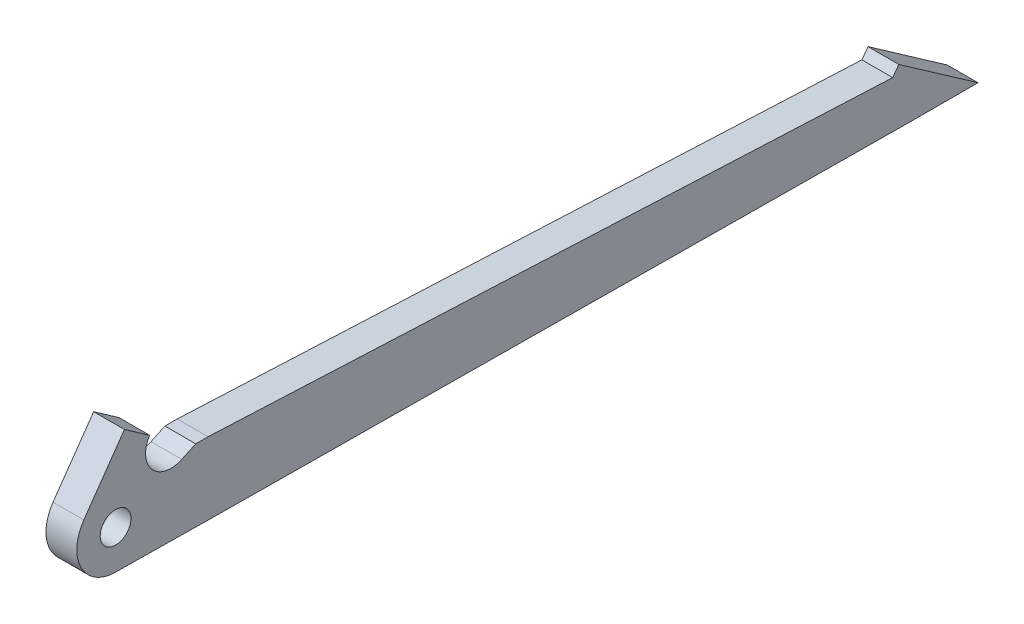
ISO-10303-21;
HEADER;
FILE_DESCRIPTION(('STEP AP214'),'2;1');
FILE_NAME('part.step','',(''),(''),'','','');
FILE_SCHEMA(('AUTOMOTIVE_DESIGN { 1 0 10303 214 1 1 1 1 }'));
ENDSEC;
DATA;
#1=APPLICATION_CONTEXT('core data for automotive mechanical design processes');
#2=APPLICATION_PROTOCOL_DEFINITION('international standard','automotive_design',2000,#1);
#3=PRODUCT_CONTEXT('',#1,'mechanical');
#4=PRODUCT('Part','Part','',(#3));
#5=PRODUCT_RELATED_PRODUCT_CATEGORY('part','',(#4));
#6=PRODUCT_DEFINITION_FORMATION('','',#4);
#7=PRODUCT_DEFINITION_CONTEXT('part definition',#1,'design');
#8=PRODUCT_DEFINITION('design','',#6,#7);
#9=PRODUCT_DEFINITION_SHAPE('','',#8);
#10=(LENGTH_UNIT() NAMED_UNIT(*) SI_UNIT(.MILLI.,.METRE.));
#11=(NAMED_UNIT(*) PLANE_ANGLE_UNIT() SI_UNIT($,.RADIAN.));
#12=(NAMED_UNIT(*) SI_UNIT($,.STERADIAN.) SOLID_ANGLE_UNIT());
#13=UNCERTAINTY_MEASURE_WITH_UNIT(LENGTH_MEASURE(1.E-05),#10,'distance_accuracy_value','');
#14=(GEOMETRIC_REPRESENTATION_CONTEXT(3) GLOBAL_UNCERTAINTY_ASSIGNED_CONTEXT((#13)) GLOBAL_UNIT_ASSIGNED_CONTEXT((#10,
#11,#12)) REPRESENTATION_CONTEXT('',''));
#15=CARTESIAN_POINT('',(0.,0.,0.));
#16=DIRECTION('',(0.,0.,1.));
#17=DIRECTION('',(1.,0.,0.));
#18=AXIS2_PLACEMENT_3D('',#15,#16,#17);
#19=CARTESIAN_POINT('',(4.7625,9.525,-176.47164647412));
#20=DIRECTION('',(1.,0.,0.));
#21=DIRECTION('',(0.,0.,-1.));
#22=AXIS2_PLACEMENT_3D('',#19,#20,#21);
#23=PLANE('',#22);
#24=CARTESIAN_POINT('',(4.7625,9.525,-176.47164647412));
#25=DIRECTION('',(1.,0.,0.));
#26=DIRECTION('',(0.,0.,-1.));
#27=AXIS2_PLACEMENT_3D('',#24,#25,#26);
#28=CIRCLE('',#27,8.00100000000001);
#29=CARTESIAN_POINT('',(4.7625,14.1141850672447,-169.917610967764));
#30=VERTEX_POINT('',#29);
#31=CARTESIAN_POINT('',(4.7625,1.52470715135464,-176.365272906379));
#32=VERTEX_POINT('',#31);
#33=EDGE_CURVE('E200',#30,#32,#28,.T.);
#34=ORIENTED_EDGE('',*,*,#33,.T.);
#35=DIRECTION('',(0.,-0.0132950340883751,-0.999911617128528));
#36=VECTOR('',#35,1.);
#37=CARTESIAN_POINT('',(4.7625,1.27000000001228,-195.521646474134));
#38=LINE('',#37,#36);
#39=CARTESIAN_POINT('',(4.7625,1.27000000001228,-195.521646474134));
#40=VERTEX_POINT('',#39);
#41=EDGE_CURVE('E202',#32,#40,#38,.T.);
#42=ORIENTED_EDGE('',*,*,#41,.T.);
#43=DIRECTION('',(0.,-0.00874942195621806,-0.999961723075155));
#44=VECTOR('',#43,1.);
#45=CARTESIAN_POINT('',(4.7625,1.27000000001228,-195.521646474134));
#46=LINE('',#45,#44);
#47=CARTESIAN_POINT('',(4.7625,1.22755538373154E-11,-340.668536709884));
#48=VERTEX_POINT('',#47);
#49=EDGE_CURVE('E189',#40,#48,#46,.T.);
#50=ORIENTED_EDGE('',*,*,#49,.T.);
#51=DIRECTION('',(0.,0.,-1.));
#52=VECTOR('',#51,1.);
#53=CARTESIAN_POINT('',(4.7625,1.22755538373154E-11,-340.668536709884));
#54=LINE('',#53,#52);
#55=CARTESIAN_POINT('',(4.7625,1.22755538373154E-11,-354.27164647412));
#56=VERTEX_POINT('',#55);
#57=EDGE_CURVE('E140',#48,#56,#54,.T.);
#58=ORIENTED_EDGE('',*,*,#57,.T.);
#59=DIRECTION('',(0.,0.573576436351047,0.819152044288991));
#60=VECTOR('',#59,1.);
#61=CARTESIAN_POINT('',(4.7625,9.52500000002455,-340.668536709884));
#62=LINE('',#61,#60);
#63=CARTESIAN_POINT('',(4.7625,11.4300000000123,-337.947914757058));
#64=VERTEX_POINT('',#63);
#65=EDGE_CURVE('E132',#56,#64,#62,.T.);
#66=ORIENTED_EDGE('',*,*,#65,.T.);
#67=DIRECTION('',(0.,-0.804869964485447,0.593451211363828));
#68=VECTOR('',#67,1.);
#69=CARTESIAN_POINT('',(4.7625,11.4300000000123,-337.947914757058));
#70=LINE('',#69,#68);
#71=CARTESIAN_POINT('',(4.7625,9.70755873555281,-336.677914757058));
#72=VERTEX_POINT('',#71);
#73=EDGE_CURVE('E136',#64,#72,#70,.T.);
#74=ORIENTED_EDGE('',*,*,#73,.T.);
#75=DIRECTION('',(0.,0.0456991439297871,0.998955248369057));
#76=VECTOR('',#75,1.);
#77=CARTESIAN_POINT('',(4.7625,16.1650258056597,-195.52164647412));
#78=LINE('',#77,#76);
#79=CARTESIAN_POINT('',(4.7625,16.1650258056597,-195.52164647412));
#80=VERTEX_POINT('',#79);
#81=EDGE_CURVE('E143',#72,#80,#78,.T.);
#82=ORIENTED_EDGE('',*,*,#81,.T.);
#83=DIRECTION('',(0.,0.,1.));
#84=VECTOR('',#83,1.);
#85=CARTESIAN_POINT('',(4.7625,16.1650258056597,-192.993410989748));
#86=LINE('',#85,#84);
#87=CARTESIAN_POINT('',(4.7625,16.1650258056597,-192.993410989748));
#88=VERTEX_POINT('',#87);
#89=EDGE_CURVE('E204',#80,#88,#86,.T.);
#90=ORIENTED_EDGE('',*,*,#89,.T.);
#91=DIRECTION('',(0.,-0.422618261740697,0.906307787036651));
#92=VECTOR('',#91,1.);
#93=CARTESIAN_POINT('',(4.7625,14.823212824633,-190.115883765906));
#94=LINE('',#93,#92);
#95=CARTESIAN_POINT('',(4.7625,14.823212824633,-190.115883765906));
#96=VERTEX_POINT('',#95);
#97=EDGE_CURVE('E206',#88,#96,#94,.T.);
#98=ORIENTED_EDGE('',*,*,#97,.T.);
#99=CARTESIAN_POINT('',(4.7625,19.5790932010246,-187.898180325126));
#100=DIRECTION('',(-1.,0.,0.));
#101=DIRECTION('',(0.,0.,-1.));
#102=AXIS2_PLACEMENT_3D('',#99,#100,#101);
#103=CIRCLE('',#102,5.24753339253749);
#104=CARTESIAN_POINT('',(4.7625,22.4356903032563,-183.496310301906));
#105=VERTEX_POINT('',#104);
#106=EDGE_CURVE('E208',#96,#105,#103,.T.);
#107=ORIENTED_EDGE('',*,*,#106,.T.);
#108=DIRECTION('',(0.,0.573576436351047,0.819152044288991));
#109=VECTOR('',#108,1.);
#110=CARTESIAN_POINT('',(4.7625,26.0779006740854,-178.294694820671));
#111=LINE('',#110,#109);
#112=CARTESIAN_POINT('',(4.7625,26.0779006740854,-178.294694820671));
#113=VERTEX_POINT('',#112);
#114=EDGE_CURVE('E210',#105,#113,#111,.T.);
#115=ORIENTED_EDGE('',*,*,#114,.T.);
#116=DIRECTION('',(0.,-0.819152044288991,0.573576436351048));
#117=VECTOR('',#116,1.);
#118=CARTESIAN_POINT('',(4.7625,14.1141850672447,-169.917610967764));
#119=LINE('',#118,#117);
#120=EDGE_CURVE('E65',#113,#30,#119,.T.);
#121=ORIENTED_EDGE('',*,*,#120,.T.);
#122=EDGE_LOOP('',(#34,#42,#50,#58,#66,#74,#82,#90,#98,#107,#115,#121));
#123=FACE_BOUND('',#122,.T.);
#124=CARTESIAN_POINT('',(4.7625,9.525,-176.47164647412));
#125=DIRECTION('',(1.,0.,0.));
#126=DIRECTION('',(0.,0.,-1.));
#127=AXIS2_PLACEMENT_3D('',#124,#125,#126);
#128=CIRCLE('',#127,3.17499999999995);
#129=CARTESIAN_POINT('',(4.7625,9.525,-173.296646474121));
#130=VERTEX_POINT('',#129);
#131=EDGE_CURVE('E196',#130,#130,#128,.T.);
#132=ORIENTED_EDGE('',*,*,#131,.F.);
#133=EDGE_LOOP('',(#132));
#134=FACE_BOUND('',#133,.T.);
#135=ADVANCED_FACE('F43',(#123,#134),#23,.T.);
#136=CARTESIAN_POINT('',(4.7625,9.525,-176.47164647412));
#137=DIRECTION('',(-1.,0.,0.));
#138=DIRECTION('',(0.,0.,1.));
#139=AXIS2_PLACEMENT_3D('',#136,#137,#138);
#140=CYLINDRICAL_SURFACE('',#139,8.00100000000001);
#141=DIRECTION('',(-1.,0.,0.));
#142=VECTOR('',#141,1.);
#143=CARTESIAN_POINT('',(4.7625,14.1141850672447,-169.917610967764));
#144=LINE('',#143,#142);
#145=CARTESIAN_POINT('',(-1.5875,14.1141850672447,-169.917610967764));
#146=VERTEX_POINT('',#145);
#147=EDGE_CURVE('E213',#30,#146,#144,.T.);
#148=ORIENTED_EDGE('',*,*,#147,.T.);
#149=CARTESIAN_POINT('',(-1.5875,9.525,-176.47164647412));
#150=DIRECTION('',(1.,0.,0.));
#151=DIRECTION('',(0.,0.,-1.));
#152=AXIS2_PLACEMENT_3D('',#149,#150,#151);
#153=CIRCLE('',#152,8.00100000000001);
#154=CARTESIAN_POINT('',(-1.5875,1.52470715135464,-176.365272906379));
#155=VERTEX_POINT('',#154);
#156=EDGE_CURVE('E171',#146,#155,#153,.T.);
#157=ORIENTED_EDGE('',*,*,#156,.T.);
#158=DIRECTION('',(-1.,0.,0.));
#159=VECTOR('',#158,1.);
#160=CARTESIAN_POINT('',(4.7625,1.52470715135464,-176.365272906379));
#161=LINE('',#160,#159);
#162=EDGE_CURVE('E51',#32,#155,#161,.T.);
#163=ORIENTED_EDGE('',*,*,#162,.F.);
#164=ORIENTED_EDGE('',*,*,#33,.F.);
#165=EDGE_LOOP('',(#148,#157,#163,#164));
#166=FACE_BOUND('',#165,.T.);
#167=ADVANCED_FACE('F45',(#166),#140,.T.);
#168=CARTESIAN_POINT('',(4.7625,1.27000000001228,-195.521646474134));
#169=DIRECTION('',(0.,0.999911617128528,-0.0132950340883751));
#170=DIRECTION('',(0.,0.0132950340883751,0.999911617128529));
#171=AXIS2_PLACEMENT_3D('',#168,#169,#170);
#172=PLANE('',#171);
#173=ORIENTED_EDGE('',*,*,#162,.T.);
#174=DIRECTION('',(0.,-0.0132950340883751,-0.999911617128529));
#175=VECTOR('',#174,1.);
#176=CARTESIAN_POINT('',(-1.5875,1.27000000001228,-195.521646474134));
#177=LINE('',#176,#175);
#178=CARTESIAN_POINT('',(-1.58749999999999,1.27000000001228,-195.521646474134));
#179=VERTEX_POINT('',#178);
#180=EDGE_CURVE('E168',#155,#179,#177,.T.);
#181=ORIENTED_EDGE('',*,*,#180,.T.);
#182=DIRECTION('',(-1.,0.,0.));
#183=VECTOR('',#182,1.);
#184=CARTESIAN_POINT('',(4.7625,1.27000000001228,-195.521646474134));
#185=LINE('',#184,#183);
#186=EDGE_CURVE('E231',#40,#179,#185,.T.);
#187=ORIENTED_EDGE('',*,*,#186,.F.);
#188=ORIENTED_EDGE('',*,*,#41,.F.);
#189=EDGE_LOOP('',(#173,#181,#187,#188));
#190=FACE_BOUND('',#189,.T.);
#191=ADVANCED_FACE('F236',(#190),#172,.F.);
#192=CARTESIAN_POINT('',(4.7625,16.1650258056597,-192.993410989748));
#193=DIRECTION('',(0.,-1.,0.));
#194=DIRECTION('',(0.,0.,-1.));
#195=AXIS2_PLACEMENT_3D('',#192,#193,#194);
#196=PLANE('',#195);
#197=DIRECTION('',(-1.,0.,0.));
#198=VECTOR('',#197,1.);
#199=CARTESIAN_POINT('',(4.7625,16.1650258056597,-195.52164647412));
#200=LINE('',#199,#198);
#201=CARTESIAN_POINT('',(-1.58749999999999,16.1650258056597,-195.52164647412));
#202=VERTEX_POINT('',#201);
#203=EDGE_CURVE('E228',#80,#202,#200,.T.);
#204=ORIENTED_EDGE('',*,*,#203,.T.);
#205=DIRECTION('',(0.,0.,1.));
#206=VECTOR('',#205,1.);
#207=CARTESIAN_POINT('',(-1.5875,16.1650258056597,-192.993410989748));
#208=LINE('',#207,#206);
#209=CARTESIAN_POINT('',(-1.5875,16.1650258056597,-192.993410989748));
#210=VERTEX_POINT('',#209);
#211=EDGE_CURVE('E165',#202,#210,#208,.T.);
#212=ORIENTED_EDGE('',*,*,#211,.T.);
#213=DIRECTION('',(-1.,0.,0.));
#214=VECTOR('',#213,1.);
#215=CARTESIAN_POINT('',(4.7625,16.1650258056597,-192.993410989748));
#216=LINE('',#215,#214);
#217=EDGE_CURVE('E225',#88,#210,#216,.T.);
#218=ORIENTED_EDGE('',*,*,#217,.F.);
#219=ORIENTED_EDGE('',*,*,#89,.F.);
#220=EDGE_LOOP('',(#204,#212,#218,#219));
#221=FACE_BOUND('',#220,.T.);
#222=ADVANCED_FACE('F258',(#221),#196,.F.);
#223=CARTESIAN_POINT('',(4.7625,14.823212824633,-190.115883765906));
#224=DIRECTION('',(0.,-0.906307787036651,-0.422618261740697));
#225=DIRECTION('',(0.,0.422618261740697,-0.906307787036651));
#226=AXIS2_PLACEMENT_3D('',#223,#224,#225);
#227=PLANE('',#226);
#228=ORIENTED_EDGE('',*,*,#217,.T.);
#229=DIRECTION('',(0.,-0.422618261740697,0.906307787036651));
#230=VECTOR('',#229,1.);
#231=CARTESIAN_POINT('',(-1.5875,14.823212824633,-190.115883765906));
#232=LINE('',#231,#230);
#233=CARTESIAN_POINT('',(-1.5875,14.823212824633,-190.115883765906));
#234=VERTEX_POINT('',#233);
#235=EDGE_CURVE('E183',#210,#234,#232,.T.);
#236=ORIENTED_EDGE('',*,*,#235,.T.);
#237=DIRECTION('',(-1.,0.,0.));
#238=VECTOR('',#237,1.);
#239=CARTESIAN_POINT('',(4.7625,14.823212824633,-190.115883765906));
#240=LINE('',#239,#238);
#241=EDGE_CURVE('E222',#96,#234,#240,.T.);
#242=ORIENTED_EDGE('',*,*,#241,.F.);
#243=ORIENTED_EDGE('',*,*,#97,.F.);
#244=EDGE_LOOP('',(#228,#236,#242,#243));
#245=FACE_BOUND('',#244,.T.);
#246=ADVANCED_FACE('F254',(#245),#227,.F.);
#247=CARTESIAN_POINT('',(4.7625,19.5790932010246,-187.898180325126));
#248=DIRECTION('',(-1.,0.,0.));
#249=DIRECTION('',(0.,0.,1.));
#250=AXIS2_PLACEMENT_3D('',#247,#248,#249);
#251=CYLINDRICAL_SURFACE('',#250,5.24753339253749);
#252=ORIENTED_EDGE('',*,*,#241,.T.);
#253=CARTESIAN_POINT('',(-1.5875,19.5790932010246,-187.898180325126));
#254=DIRECTION('',(1.,0.,0.));
#255=DIRECTION('',(0.,0.,-1.));
#256=AXIS2_PLACEMENT_3D('',#253,#254,#255);
#257=CIRCLE('',#256,5.24753339253749);
#258=CARTESIAN_POINT('',(-1.5875,22.4356903032563,-183.496310301906));
#259=VERTEX_POINT('',#258);
#260=EDGE_CURVE('E180',#234,#259,#257,.F.);
#261=ORIENTED_EDGE('',*,*,#260,.T.);
#262=DIRECTION('',(-1.,0.,0.));
#263=VECTOR('',#262,1.);
#264=CARTESIAN_POINT('',(4.7625,22.4356903032563,-183.496310301906));
#265=LINE('',#264,#263);
#266=EDGE_CURVE('E219',#105,#259,#265,.T.);
#267=ORIENTED_EDGE('',*,*,#266,.F.);
#268=ORIENTED_EDGE('',*,*,#106,.F.);
#269=EDGE_LOOP('',(#252,#261,#267,#268));
#270=FACE_BOUND('',#269,.T.);
#271=ADVANCED_FACE('F249',(#270),#251,.F.);
#272=CARTESIAN_POINT('',(4.7625,26.0779006740854,-178.294694820671));
#273=DIRECTION('',(0.,-0.819152044288991,0.573576436351047));
#274=DIRECTION('',(0.,-0.573576436351047,-0.819152044288991));
#275=AXIS2_PLACEMENT_3D('',#272,#273,#274);
#276=PLANE('',#275);
#277=ORIENTED_EDGE('',*,*,#266,.T.);
#278=DIRECTION('',(0.,0.573576436351047,0.819152044288991));
#279=VECTOR('',#278,1.);
#280=CARTESIAN_POINT('',(-1.5875,26.0779006740854,-178.294694820671));
#281=LINE('',#280,#279);
#282=CARTESIAN_POINT('',(-1.5875,26.0779006740854,-178.294694820671));
#283=VERTEX_POINT('',#282);
#284=EDGE_CURVE('E177',#259,#283,#281,.T.);
#285=ORIENTED_EDGE('',*,*,#284,.T.);
#286=DIRECTION('',(-1.,0.,0.));
#287=VECTOR('',#286,1.);
#288=CARTESIAN_POINT('',(4.7625,26.0779006740854,-178.294694820671));
#289=LINE('',#288,#287);
#290=EDGE_CURVE('E216',#113,#283,#289,.T.);
#291=ORIENTED_EDGE('',*,*,#290,.F.);
#292=ORIENTED_EDGE('',*,*,#114,.F.);
#293=EDGE_LOOP('',(#277,#285,#291,#292));
#294=FACE_BOUND('',#293,.T.);
#295=ADVANCED_FACE('F246',(#294),#276,.F.);
#296=CARTESIAN_POINT('',(4.7625,14.1141850672447,-169.917610967764));
#297=DIRECTION('',(0.,-0.573576436351048,-0.81915204428899));
#298=DIRECTION('',(0.,0.819152044288991,-0.573576436351048));
#299=AXIS2_PLACEMENT_3D('',#296,#297,#298);
#300=PLANE('',#299);
#301=ORIENTED_EDGE('',*,*,#290,.T.);
#302=DIRECTION('',(0.,-0.819152044288991,0.573576436351048));
#303=VECTOR('',#302,1.);
#304=CARTESIAN_POINT('',(-1.5875,14.1141850672447,-169.917610967764));
#305=LINE('',#304,#303);
#306=EDGE_CURVE('E174',#283,#146,#305,.T.);
#307=ORIENTED_EDGE('',*,*,#306,.T.);
#308=ORIENTED_EDGE('',*,*,#147,.F.);
#309=ORIENTED_EDGE('',*,*,#120,.F.);
#310=EDGE_LOOP('',(#301,#307,#308,#309));
#311=FACE_BOUND('',#310,.T.);
#312=ADVANCED_FACE('F242',(#311),#300,.F.);
#313=CARTESIAN_POINT('',(4.7625,9.525,-176.47164647412));
#314=DIRECTION('',(-1.,0.,0.));
#315=DIRECTION('',(0.,0.,1.));
#316=AXIS2_PLACEMENT_3D('',#313,#314,#315);
#317=CYLINDRICAL_SURFACE('',#316,3.17499999999995);
#318=CARTESIAN_POINT('',(-1.5875,9.525,-176.47164647412));
#319=DIRECTION('',(1.,0.,0.));
#320=DIRECTION('',(0.,0.,-1.));
#321=AXIS2_PLACEMENT_3D('',#318,#319,#320);
#322=CIRCLE('',#321,3.17499999999995);
#323=CARTESIAN_POINT('',(-1.5875,9.525,-173.296646474121));
#324=VERTEX_POINT('',#323);
#325=EDGE_CURVE('E186',#324,#324,#322,.T.);
#326=CARTESIAN_POINT('',(-1.5875,9.525,-173.296646474121));
#327=CARTESIAN_POINT('',(-1.52135416666667,9.525,-173.296646474121));
#328=CARTESIAN_POINT('',(-1.45520833333333,9.525,-173.296646474121));
#329=CARTESIAN_POINT('',(-1.32291666666667,9.525,-173.296646474121));
#330=CARTESIAN_POINT('',(-1.25677083333333,9.525,-173.296646474121));
#331=CARTESIAN_POINT('',(-1.12447916666667,9.525,-173.296646474121));
#332=CARTESIAN_POINT('',(-1.05833333333333,9.525,-173.296646474121));
#333=CARTESIAN_POINT('',(-0.926041666666667,9.525,-173.296646474121));
#334=CARTESIAN_POINT('',(-0.859895833333334,9.525,-173.296646474121));
#335=CARTESIAN_POINT('',(-0.727604166666667,9.525,-173.296646474121));
#336=CARTESIAN_POINT('',(-0.661458333333334,9.525,-173.296646474121));
#337=CARTESIAN_POINT('',(-0.529166666666667,9.525,-173.296646474121));
#338=CARTESIAN_POINT('',(-0.463020833333333,9.525,-173.296646474121));
#339=CARTESIAN_POINT('',(-0.330729166666666,9.525,-173.296646474121));
#340=CARTESIAN_POINT('',(-0.264583333333333,9.525,-173.296646474121));
#341=CARTESIAN_POINT('',(-0.132291666666667,9.525,-173.296646474121));
#342=CARTESIAN_POINT('',(-0.0661458333333333,9.525,-173.296646474121));
#343=CARTESIAN_POINT('',(0.0661458333333333,9.525,-173.296646474121));
#344=CARTESIAN_POINT('',(0.132291666666667,9.525,-173.296646474121));
#345=CARTESIAN_POINT('',(0.264583333333333,9.525,-173.296646474121));
#346=CARTESIAN_POINT('',(0.330729166666666,9.525,-173.296646474121));
#347=CARTESIAN_POINT('',(0.463020833333333,9.525,-173.296646474121));
#348=CARTESIAN_POINT('',(0.529166666666667,9.525,-173.296646474121));
#349=CARTESIAN_POINT('',(0.661458333333334,9.525,-173.296646474121));
#350=CARTESIAN_POINT('',(0.727604166666667,9.525,-173.296646474121));
#351=CARTESIAN_POINT('',(0.859895833333333,9.525,-173.296646474121));
#352=CARTESIAN_POINT('',(0.926041666666666,9.525,-173.296646474121));
#353=CARTESIAN_POINT('',(1.05833333333333,9.525,-173.296646474121));
#354=CARTESIAN_POINT('',(1.12447916666667,9.525,-173.296646474121));
#355=CARTESIAN_POINT('',(1.25677083333333,9.525,-173.296646474121));
#356=CARTESIAN_POINT('',(1.32291666666667,9.525,-173.296646474121));
#357=CARTESIAN_POINT('',(1.45520833333333,9.525,-173.296646474121));
#358=CARTESIAN_POINT('',(1.52135416666667,9.525,-173.296646474121));
#359=CARTESIAN_POINT('',(1.65364583333333,9.525,-173.296646474121));
#360=CARTESIAN_POINT('',(1.71979166666667,9.525,-173.296646474121));
#361=CARTESIAN_POINT('',(1.85208333333333,9.525,-173.296646474121));
#362=CARTESIAN_POINT('',(1.91822916666667,9.525,-173.296646474121));
#363=CARTESIAN_POINT('',(2.05052083333333,9.525,-173.296646474121));
#364=CARTESIAN_POINT('',(2.11666666666667,9.525,-173.296646474121));
#365=CARTESIAN_POINT('',(2.24895833333333,9.525,-173.296646474121));
#366=CARTESIAN_POINT('',(2.31510416666667,9.525,-173.296646474121));
#367=CARTESIAN_POINT('',(2.44739583333333,9.525,-173.296646474121));
#368=CARTESIAN_POINT('',(2.51354166666667,9.525,-173.296646474121));
#369=CARTESIAN_POINT('',(2.64583333333333,9.525,-173.296646474121));
#370=CARTESIAN_POINT('',(2.71197916666667,9.525,-173.296646474121));
#371=CARTESIAN_POINT('',(2.84427083333333,9.525,-173.296646474121));
#372=CARTESIAN_POINT('',(2.91041666666667,9.525,-173.296646474121));
#373=CARTESIAN_POINT('',(3.04270833333333,9.525,-173.296646474121));
#374=CARTESIAN_POINT('',(3.10885416666667,9.525,-173.296646474121));
#375=CARTESIAN_POINT('',(3.24114583333333,9.525,-173.296646474121));
#376=CARTESIAN_POINT('',(3.30729166666667,9.525,-173.296646474121));
#377=CARTESIAN_POINT('',(3.43958333333333,9.525,-173.296646474121));
#378=CARTESIAN_POINT('',(3.50572916666667,9.525,-173.296646474121));
#379=CARTESIAN_POINT('',(3.63802083333333,9.525,-173.296646474121));
#380=CARTESIAN_POINT('',(3.70416666666667,9.525,-173.296646474121));
#381=CARTESIAN_POINT('',(3.83645833333333,9.525,-173.296646474121));
#382=CARTESIAN_POINT('',(3.90260416666667,9.525,-173.296646474121));
#383=CARTESIAN_POINT('',(4.03489583333333,9.525,-173.296646474121));
#384=CARTESIAN_POINT('',(4.10104166666667,9.525,-173.296646474121));
#385=CARTESIAN_POINT('',(4.23333333333333,9.525,-173.296646474121));
#386=CARTESIAN_POINT('',(4.29947916666667,9.525,-173.296646474121));
#387=CARTESIAN_POINT('',(4.43177083333333,9.525,-173.296646474121));
#388=CARTESIAN_POINT('',(4.49791666666667,9.525,-173.296646474121));
#389=CARTESIAN_POINT('',(4.63020833333333,9.525,-173.296646474121));
#390=CARTESIAN_POINT('',(4.69635416666667,9.525,-173.296646474121));
#391=CARTESIAN_POINT('',(4.7625,9.525,-173.296646474121));
#392=B_SPLINE_CURVE_WITH_KNOTS('',3,(#326,#327,#328,#329,#330,#331,#332,#333,#334,#335,#336,
#337,#338,#339,#340,#341,#342,#343,#344,#345,#346,#347,#348,#349,#350,#351,#352,#353,#354,#355,
#356,#357,#358,#359,#360,#361,#362,#363,#364,#365,#366,#367,#368,#369,#370,#371,#372,#373,#374,
#375,#376,#377,#378,#379,#380,#381,#382,#383,#384,#385,#386,#387,#388,#389,#390,#391),
.UNSPECIFIED.,.F.,.F.,(4,2,2,2,2,2,2,2,2,2,2,2,2,2,2,2,2,2,2,2,2,2,2,2,2,2,2,2,2,2,2,2,4),(0.,
0.1984375,0.396875,0.5953125,0.79375,0.9921875,1.190625,1.3890625,1.5875,1.7859375,1.984375,
2.1828125,2.38125,2.5796875,2.778125,2.9765625,3.175,3.3734375,3.571875,3.7703125,3.96875,
4.1671875,4.365625,4.5640625,4.7625,4.9609375,5.159375,5.3578125,5.55625,5.7546875,5.953125,
6.1515625,6.35),.UNSPECIFIED.);
#393=EDGE_CURVE('BSEAM285',#324,#130,#392,.T.);
#394=ORIENTED_EDGE('',*,*,#325,.F.);
#395=ORIENTED_EDGE('',*,*,#131,.T.);
#396=ORIENTED_EDGE('',*,*,#393,.T.);
#397=ORIENTED_EDGE('',*,*,#393,.F.);
#398=EDGE_LOOP('',(#394,#396,#395,#397));
#399=FACE_BOUND('',#398,.T.);
#400=ADVANCED_FACE('F285',(#399),#317,.F.);
#401=CARTESIAN_POINT('',(-164.33339508835,16.1650258056597,-195.52164647412));
#402=DIRECTION('',(0.,0.998955248369057,-0.0456991439297871));
#403=DIRECTION('',(0.,0.0456991439297871,0.998955248369057));
#404=AXIS2_PLACEMENT_3D('',#401,#402,#403);
#405=PLANE('',#404);
#406=DIRECTION('',(1.,0.,0.));
#407=VECTOR('',#406,1.);
#408=CARTESIAN_POINT('',(-6.00950051677196,9.70755873555281,-336.677914757058));
#409=LINE('',#408,#407);
#410=CARTESIAN_POINT('',(-1.5875,9.70755873555281,-336.677914757058));
#411=VERTEX_POINT('',#410);
#412=EDGE_CURVE('E151',#411,#72,#409,.T.);
#413=ORIENTED_EDGE('',*,*,#412,.F.);
#414=DIRECTION('',(0.,-0.0456991439297871,-0.998955248369057));
#415=VECTOR('',#414,1.);
#416=CARTESIAN_POINT('',(-1.58749999999999,16.1650258056597,-195.52164647412));
#417=LINE('',#416,#415);
#418=EDGE_CURVE('E162',#202,#411,#417,.T.);
#419=ORIENTED_EDGE('',*,*,#418,.F.);
#420=ORIENTED_EDGE('',*,*,#203,.F.);
#421=ORIENTED_EDGE('',*,*,#81,.F.);
#422=EDGE_LOOP('',(#413,#419,#420,#421));
#423=FACE_BOUND('',#422,.T.);
#424=ADVANCED_FACE('F262',(#423),#405,.T.);
#425=CARTESIAN_POINT('',(-164.33339508835,9.52500000002455,-340.668536709884));
#426=DIRECTION('',(0.,0.819152044288991,-0.573576436351047));
#427=DIRECTION('',(0.,0.573576436351047,0.819152044288991));
#428=AXIS2_PLACEMENT_3D('',#425,#426,#427);
#429=PLANE('',#428);
#430=DIRECTION('',(0.,-0.573576436351047,-0.819152044288991));
#431=VECTOR('',#430,1.);
#432=CARTESIAN_POINT('',(-1.58749999999999,9.52500000002455,-340.668536709884));
#433=LINE('',#432,#431);
#434=CARTESIAN_POINT('',(-1.5875,11.4300000000123,-337.947914757058));
#435=VERTEX_POINT('',#434);
#436=CARTESIAN_POINT('',(-1.58749999999996,1.22749033160119E-11,-354.27164647412));
#437=VERTEX_POINT('',#436);
#438=EDGE_CURVE('E148',#435,#437,#433,.T.);
#439=ORIENTED_EDGE('',*,*,#438,.F.);
#440=DIRECTION('',(1.,0.,0.));
#441=VECTOR('',#440,1.);
#442=CARTESIAN_POINT('',(-6.00950051677196,11.4300000000123,-337.947914757058));
#443=LINE('',#442,#441);
#444=EDGE_CURVE('E146',#435,#64,#443,.T.);
#445=ORIENTED_EDGE('',*,*,#444,.T.);
#446=ORIENTED_EDGE('',*,*,#65,.F.);
#447=DIRECTION('',(1.,0.,0.));
#448=VECTOR('',#447,1.);
#449=CARTESIAN_POINT('',(-164.33339508835,1.22755538373154E-11,-354.27164647412));
#450=LINE('',#449,#448);
#451=EDGE_CURVE('E194',#437,#56,#450,.T.);
#452=ORIENTED_EDGE('',*,*,#451,.F.);
#453=EDGE_LOOP('',(#439,#445,#446,#452));
#454=FACE_BOUND('',#453,.T.);
#455=ADVANCED_FACE('F147',(#454),#429,.T.);
#456=CARTESIAN_POINT('',(-164.33339508835,1.22755538373154E-11,-340.668536709884));
#457=DIRECTION('',(0.,-1.,0.));
#458=DIRECTION('',(0.,0.,-1.));
#459=AXIS2_PLACEMENT_3D('',#456,#457,#458);
#460=PLANE('',#459);
#461=DIRECTION('',(0.,0.,1.));
#462=VECTOR('',#461,1.);
#463=CARTESIAN_POINT('',(-1.58749999999999,1.22755538373154E-11,-340.668536709884));
#464=LINE('',#463,#462);
#465=CARTESIAN_POINT('',(-1.58749999999999,1.22755538373154E-11,-340.668536709884));
#466=VERTEX_POINT('',#465);
#467=EDGE_CURVE('E57',#437,#466,#464,.T.);
#468=ORIENTED_EDGE('',*,*,#467,.F.);
#469=ORIENTED_EDGE('',*,*,#451,.T.);
#470=ORIENTED_EDGE('',*,*,#57,.F.);
#471=DIRECTION('',(1.,0.,0.));
#472=VECTOR('',#471,1.);
#473=CARTESIAN_POINT('',(-164.33339508835,1.22755538373154E-11,-340.668536709884));
#474=LINE('',#473,#472);
#475=EDGE_CURVE('E193',#466,#48,#474,.T.);
#476=ORIENTED_EDGE('',*,*,#475,.F.);
#477=EDGE_LOOP('',(#468,#469,#470,#476));
#478=FACE_BOUND('',#477,.T.);
#479=ADVANCED_FACE('F265',(#478),#460,.T.);
#480=CARTESIAN_POINT('',(-164.33339508835,1.27000000001228,-195.521646474134));
#481=DIRECTION('',(0.,-0.999961723075155,0.00874942195621806));
#482=DIRECTION('',(0.,-0.00874942195621806,-0.999961723075155));
#483=AXIS2_PLACEMENT_3D('',#480,#481,#482);
#484=PLANE('',#483);
#485=DIRECTION('',(0.,0.00874942195621806,0.999961723075155));
#486=VECTOR('',#485,1.);
#487=CARTESIAN_POINT('',(-1.58749999999999,1.27000000001228,-195.521646474134));
#488=LINE('',#487,#486);
#489=EDGE_CURVE('E12',#466,#179,#488,.T.);
#490=ORIENTED_EDGE('',*,*,#489,.F.);
#491=ORIENTED_EDGE('',*,*,#475,.T.);
#492=ORIENTED_EDGE('',*,*,#49,.F.);
#493=ORIENTED_EDGE('',*,*,#186,.T.);
#494=EDGE_LOOP('',(#490,#491,#492,#493));
#495=FACE_BOUND('',#494,.T.);
#496=ADVANCED_FACE('F268',(#495),#484,.T.);
#497=CARTESIAN_POINT('',(-1.5875,9.525,-176.47164647412));
#498=DIRECTION('',(1.,0.,0.));
#499=DIRECTION('',(0.,0.,-1.));
#500=AXIS2_PLACEMENT_3D('',#497,#498,#499);
#501=PLANE('',#500);
#502=ORIENTED_EDGE('',*,*,#325,.T.);
#503=EDGE_LOOP('',(#502));
#504=FACE_BOUND('',#503,.T.);
#505=ORIENTED_EDGE('',*,*,#211,.F.);
#506=ORIENTED_EDGE('',*,*,#418,.T.);
#507=DIRECTION('',(0.,0.804869964485447,-0.593451211363828));
#508=VECTOR('',#507,1.);
#509=CARTESIAN_POINT('',(-1.5875,11.4300000000123,-337.947914757058));
#510=LINE('',#509,#508);
#511=EDGE_CURVE('E158',#411,#435,#510,.T.);
#512=ORIENTED_EDGE('',*,*,#511,.T.);
#513=ORIENTED_EDGE('',*,*,#438,.T.);
#514=ORIENTED_EDGE('',*,*,#467,.T.);
#515=ORIENTED_EDGE('',*,*,#489,.T.);
#516=ORIENTED_EDGE('',*,*,#180,.F.);
#517=ORIENTED_EDGE('',*,*,#156,.F.);
#518=ORIENTED_EDGE('',*,*,#306,.F.);
#519=ORIENTED_EDGE('',*,*,#284,.F.);
#520=ORIENTED_EDGE('',*,*,#260,.F.);
#521=ORIENTED_EDGE('',*,*,#235,.F.);
#522=EDGE_LOOP('',(#505,#506,#512,#513,#514,#515,#516,#517,#518,#519,#520,#521));
#523=FACE_BOUND('',#522,.T.);
#524=ADVANCED_FACE('F240',(#504,#523),#501,.F.);
#525=CARTESIAN_POINT('',(-6.00950051677196,11.4300000000123,-337.947914757058));
#526=DIRECTION('',(0.,0.593451211363828,0.804869964485447));
#527=DIRECTION('',(0.,-0.804869964485447,0.593451211363828));
#528=AXIS2_PLACEMENT_3D('',#525,#526,#527);
#529=PLANE('',#528);
#530=ORIENTED_EDGE('',*,*,#511,.F.);
#531=ORIENTED_EDGE('',*,*,#412,.T.);
#532=ORIENTED_EDGE('',*,*,#73,.F.);
#533=ORIENTED_EDGE('',*,*,#444,.F.);
#534=EDGE_LOOP('',(#530,#531,#532,#533));
#535=FACE_BOUND('',#534,.T.);
#536=ADVANCED_FACE('F153',(#535),#529,.T.);
#537=CLOSED_SHELL('',(#135,#167,#191,#222,#246,#271,#295,#312,#400,#424,#455,#479,#496,#524,#536));
#538=MANIFOLD_SOLID_BREP('B2',#537);
#539=ADVANCED_BREP_SHAPE_REPRESENTATION('',(#18,#538),#14);
#540=SHAPE_DEFINITION_REPRESENTATION(#9,#539);
ENDSEC;
END-ISO-10303-21;
